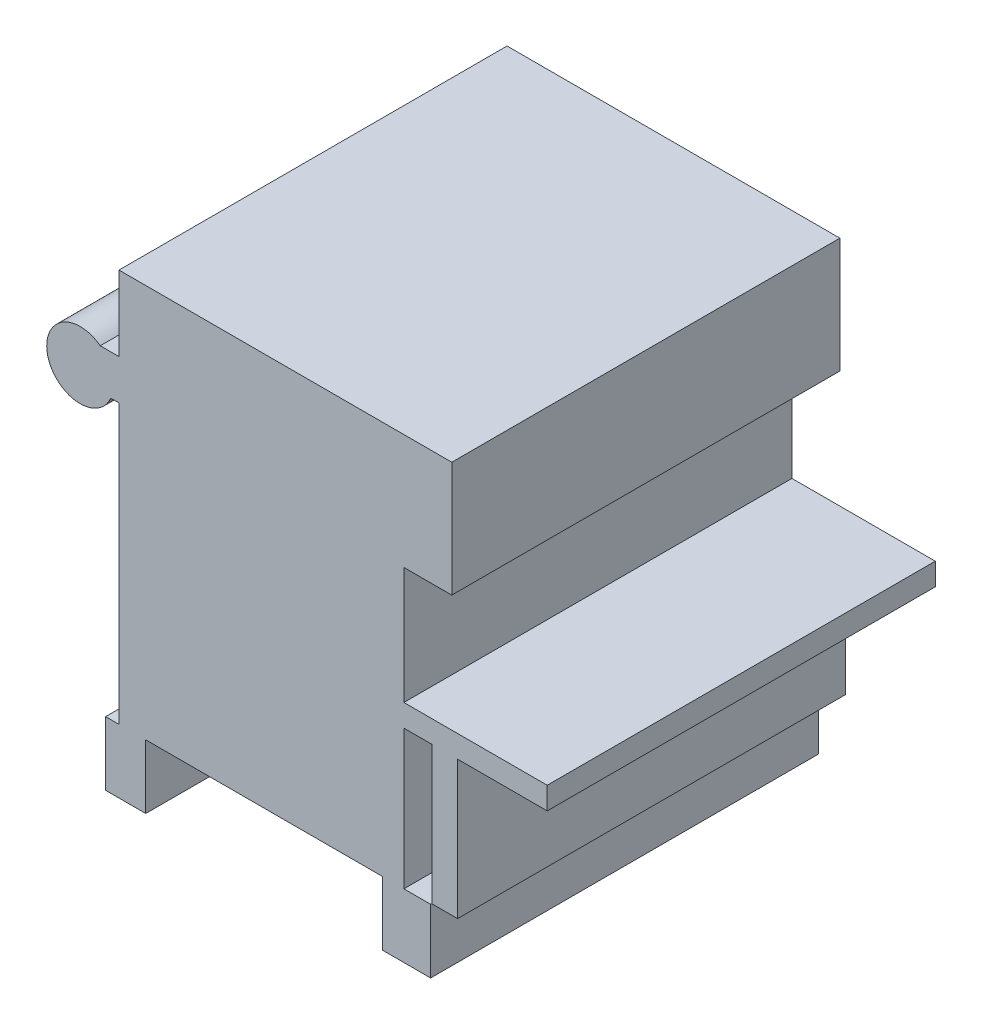
ISO-10303-21;
HEADER;
FILE_DESCRIPTION(('STEP AP214'),'2;1');
FILE_NAME('part.step','',(''),(''),'','','');
FILE_SCHEMA(('AUTOMOTIVE_DESIGN { 1 0 10303 214 1 1 1 1 }'));
ENDSEC;
DATA;
#1=APPLICATION_CONTEXT('core data for automotive mechanical design processes');
#2=APPLICATION_PROTOCOL_DEFINITION('international standard','automotive_design',2000,#1);
#3=PRODUCT_CONTEXT('',#1,'mechanical');
#4=PRODUCT('Part','Part','',(#3));
#5=PRODUCT_RELATED_PRODUCT_CATEGORY('part','',(#4));
#6=PRODUCT_DEFINITION_FORMATION('','',#4);
#7=PRODUCT_DEFINITION_CONTEXT('part definition',#1,'design');
#8=PRODUCT_DEFINITION('design','',#6,#7);
#9=PRODUCT_DEFINITION_SHAPE('','',#8);
#10=(LENGTH_UNIT() NAMED_UNIT(*) SI_UNIT(.MILLI.,.METRE.));
#11=(NAMED_UNIT(*) PLANE_ANGLE_UNIT() SI_UNIT($,.RADIAN.));
#12=(NAMED_UNIT(*) SI_UNIT($,.STERADIAN.) SOLID_ANGLE_UNIT());
#13=UNCERTAINTY_MEASURE_WITH_UNIT(LENGTH_MEASURE(1.E-05),#10,'distance_accuracy_value','');
#14=(GEOMETRIC_REPRESENTATION_CONTEXT(3) GLOBAL_UNCERTAINTY_ASSIGNED_CONTEXT((#13)) GLOBAL_UNIT_ASSIGNED_CONTEXT((#10,
#11,#12)) REPRESENTATION_CONTEXT('',''));
#15=CARTESIAN_POINT('',(0.,0.,0.));
#16=DIRECTION('',(0.,0.,1.));
#17=DIRECTION('',(1.,0.,0.));
#18=AXIS2_PLACEMENT_3D('',#15,#16,#17);
#19=CARTESIAN_POINT('',(0.,0.,736.6));
#20=DIRECTION('',(0.,-1.,0.));
#21=DIRECTION('',(1.,0.,0.));
#22=AXIS2_PLACEMENT_3D('',#19,#20,#21);
#23=PLANE('',#22);
#24=DIRECTION('',(-1.,0.,0.));
#25=VECTOR('',#24,1.);
#26=CARTESIAN_POINT('',(0.,0.,0.));
#27=LINE('',#26,#25);
#28=CARTESIAN_POINT('',(0.,0.,0.));
#29=VERTEX_POINT('',#28);
#30=CARTESIAN_POINT('',(-25.4,0.,0.));
#31=VERTEX_POINT('',#30);
#32=EDGE_CURVE('E245',#29,#31,#27,.T.);
#33=ORIENTED_EDGE('',*,*,#32,.T.);
#34=DIRECTION('',(0.,0.,-1.));
#35=VECTOR('',#34,1.);
#36=CARTESIAN_POINT('',(-25.4,0.,736.6));
#37=LINE('',#36,#35);
#38=CARTESIAN_POINT('',(-25.4,0.,736.6));
#39=VERTEX_POINT('',#38);
#40=EDGE_CURVE('E11',#39,#31,#37,.T.);
#41=ORIENTED_EDGE('',*,*,#40,.F.);
#42=DIRECTION('',(-1.,0.,0.));
#43=VECTOR('',#42,1.);
#44=CARTESIAN_POINT('',(0.,0.,736.6));
#45=LINE('',#44,#43);
#46=CARTESIAN_POINT('',(0.,0.,736.6));
#47=VERTEX_POINT('',#46);
#48=EDGE_CURVE('E296',#47,#39,#45,.T.);
#49=ORIENTED_EDGE('',*,*,#48,.F.);
#50=DIRECTION('',(0.,0.,-1.));
#51=VECTOR('',#50,1.);
#52=CARTESIAN_POINT('',(0.,0.,736.6));
#53=LINE('',#52,#51);
#54=EDGE_CURVE('E241',#47,#29,#53,.T.);
#55=ORIENTED_EDGE('',*,*,#54,.T.);
#56=EDGE_LOOP('',(#33,#41,#49,#55));
#57=FACE_BOUND('',#56,.T.);
#58=ADVANCED_FACE('F41',(#57),#23,.F.);
#59=CARTESIAN_POINT('',(-25.4,0.,736.6));
#60=DIRECTION('',(1.,0.,0.));
#61=DIRECTION('',(0.,1.,0.));
#62=AXIS2_PLACEMENT_3D('',#59,#60,#61);
#63=PLANE('',#62);
#64=DIRECTION('',(0.,-1.,0.));
#65=VECTOR('',#64,1.);
#66=CARTESIAN_POINT('',(-25.4,0.,0.));
#67=LINE('',#66,#65);
#68=CARTESIAN_POINT('',(-25.4,-121.158,0.));
#69=VERTEX_POINT('',#68);
#70=EDGE_CURVE('E248',#31,#69,#67,.T.);
#71=ORIENTED_EDGE('',*,*,#70,.T.);
#72=DIRECTION('',(0.,0.,-1.));
#73=VECTOR('',#72,1.);
#74=CARTESIAN_POINT('',(-25.4,-121.158,736.6));
#75=LINE('',#74,#73);
#76=CARTESIAN_POINT('',(-25.4,-121.158,736.6));
#77=VERTEX_POINT('',#76);
#78=EDGE_CURVE('E49',#77,#69,#75,.T.);
#79=ORIENTED_EDGE('',*,*,#78,.F.);
#80=DIRECTION('',(0.,-1.,0.));
#81=VECTOR('',#80,1.);
#82=CARTESIAN_POINT('',(-25.4,0.,736.6));
#83=LINE('',#82,#81);
#84=EDGE_CURVE('E154',#39,#77,#83,.T.);
#85=ORIENTED_EDGE('',*,*,#84,.F.);
#86=ORIENTED_EDGE('',*,*,#40,.T.);
#87=EDGE_LOOP('',(#71,#79,#85,#86));
#88=FACE_BOUND('',#87,.T.);
#89=ADVANCED_FACE('F444',(#88),#63,.F.);
#90=CARTESIAN_POINT('',(50.8,-121.158,736.6));
#91=DIRECTION('',(0.,1.,0.));
#92=DIRECTION('',(0.,0.,1.));
#93=AXIS2_PLACEMENT_3D('',#90,#91,#92);
#94=PLANE('',#93);
#95=DIRECTION('',(1.,0.,0.));
#96=VECTOR('',#95,1.);
#97=CARTESIAN_POINT('',(50.8,-121.158,0.));
#98=LINE('',#97,#96);
#99=CARTESIAN_POINT('',(50.8,-121.158,0.));
#100=VERTEX_POINT('',#99);
#101=EDGE_CURVE('E250',#69,#100,#98,.T.);
#102=ORIENTED_EDGE('',*,*,#101,.T.);
#103=DIRECTION('',(0.,0.,-1.));
#104=VECTOR('',#103,1.);
#105=CARTESIAN_POINT('',(50.8,-121.158,736.6));
#106=LINE('',#105,#104);
#107=CARTESIAN_POINT('',(50.8,-121.158,736.6));
#108=VERTEX_POINT('',#107);
#109=EDGE_CURVE('E357',#108,#100,#106,.T.);
#110=ORIENTED_EDGE('',*,*,#109,.F.);
#111=DIRECTION('',(1.,0.,0.));
#112=VECTOR('',#111,1.);
#113=CARTESIAN_POINT('',(50.8,-121.158,736.6));
#114=LINE('',#113,#112);
#115=EDGE_CURVE('E365',#77,#108,#114,.T.);
#116=ORIENTED_EDGE('',*,*,#115,.F.);
#117=ORIENTED_EDGE('',*,*,#78,.T.);
#118=EDGE_LOOP('',(#102,#110,#116,#117));
#119=FACE_BOUND('',#118,.T.);
#120=ADVANCED_FACE('F363',(#119),#94,.F.);
#121=CARTESIAN_POINT('',(50.8,0.,736.6));
#122=DIRECTION('',(-1.,0.,0.));
#123=DIRECTION('',(0.,-1.,0.));
#124=AXIS2_PLACEMENT_3D('',#121,#122,#123);
#125=PLANE('',#124);
#126=DIRECTION('',(0.,1.,0.));
#127=VECTOR('',#126,1.);
#128=CARTESIAN_POINT('',(50.8,0.,0.));
#129=LINE('',#128,#127);
#130=CARTESIAN_POINT('',(50.8,0.,0.));
#131=VERTEX_POINT('',#130);
#132=EDGE_CURVE('E252',#100,#131,#129,.T.);
#133=ORIENTED_EDGE('',*,*,#132,.T.);
#134=DIRECTION('',(0.,0.,-1.));
#135=VECTOR('',#134,1.);
#136=CARTESIAN_POINT('',(50.8,0.,736.6));
#137=LINE('',#136,#135);
#138=CARTESIAN_POINT('',(50.8,0.,736.6));
#139=VERTEX_POINT('',#138);
#140=EDGE_CURVE('E354',#139,#131,#137,.T.);
#141=ORIENTED_EDGE('',*,*,#140,.F.);
#142=DIRECTION('',(0.,1.,0.));
#143=VECTOR('',#142,1.);
#144=CARTESIAN_POINT('',(50.8,0.,736.6));
#145=LINE('',#144,#143);
#146=EDGE_CURVE('E383',#108,#139,#145,.T.);
#147=ORIENTED_EDGE('',*,*,#146,.F.);
#148=ORIENTED_EDGE('',*,*,#109,.T.);
#149=EDGE_LOOP('',(#133,#141,#147,#148));
#150=FACE_BOUND('',#149,.T.);
#151=ADVANCED_FACE('F374',(#150),#125,.F.);
#152=CARTESIAN_POINT('',(50.8,0.,736.6));
#153=DIRECTION('',(0.,1.,0.));
#154=DIRECTION('',(-1.,0.,0.));
#155=AXIS2_PLACEMENT_3D('',#152,#153,#154);
#156=PLANE('',#155);
#157=DIRECTION('',(1.,0.,0.));
#158=VECTOR('',#157,1.);
#159=CARTESIAN_POINT('',(50.8,0.,0.));
#160=LINE('',#159,#158);
#161=CARTESIAN_POINT('',(500.126,0.,0.));
#162=VERTEX_POINT('',#161);
#163=EDGE_CURVE('E254',#131,#162,#160,.T.);
#164=ORIENTED_EDGE('',*,*,#163,.T.);
#165=DIRECTION('',(0.,0.,-1.));
#166=VECTOR('',#165,1.);
#167=CARTESIAN_POINT('',(500.126,0.,736.6));
#168=LINE('',#167,#166);
#169=CARTESIAN_POINT('',(500.126,0.,736.6));
#170=VERTEX_POINT('',#169);
#171=EDGE_CURVE('E351',#170,#162,#168,.T.);
#172=ORIENTED_EDGE('',*,*,#171,.F.);
#173=DIRECTION('',(1.,0.,0.));
#174=VECTOR('',#173,1.);
#175=CARTESIAN_POINT('',(50.8,0.,736.6));
#176=LINE('',#175,#174);
#177=EDGE_CURVE('E380',#139,#170,#176,.T.);
#178=ORIENTED_EDGE('',*,*,#177,.F.);
#179=ORIENTED_EDGE('',*,*,#140,.T.);
#180=EDGE_LOOP('',(#164,#172,#178,#179));
#181=FACE_BOUND('',#180,.T.);
#182=ADVANCED_FACE('F378',(#181),#156,.F.);
#183=CARTESIAN_POINT('',(500.126,0.,736.6));
#184=DIRECTION('',(1.,0.,0.));
#185=DIRECTION('',(0.,0.,-1.));
#186=AXIS2_PLACEMENT_3D('',#183,#184,#185);
#187=PLANE('',#186);
#188=DIRECTION('',(0.,-1.,0.));
#189=VECTOR('',#188,1.);
#190=CARTESIAN_POINT('',(500.126,0.,0.));
#191=LINE('',#190,#189);
#192=CARTESIAN_POINT('',(500.126,-121.158,0.));
#193=VERTEX_POINT('',#192);
#194=EDGE_CURVE('E256',#162,#193,#191,.T.);
#195=ORIENTED_EDGE('',*,*,#194,.T.);
#196=DIRECTION('',(0.,0.,-1.));
#197=VECTOR('',#196,1.);
#198=CARTESIAN_POINT('',(500.126,-121.158,736.6));
#199=LINE('',#198,#197);
#200=CARTESIAN_POINT('',(500.126,-121.158,736.6));
#201=VERTEX_POINT('',#200);
#202=EDGE_CURVE('E348',#201,#193,#199,.T.);
#203=ORIENTED_EDGE('',*,*,#202,.F.);
#204=DIRECTION('',(0.,-1.,0.));
#205=VECTOR('',#204,1.);
#206=CARTESIAN_POINT('',(500.126,0.,736.6));
#207=LINE('',#206,#205);
#208=EDGE_CURVE('E382',#170,#201,#207,.T.);
#209=ORIENTED_EDGE('',*,*,#208,.F.);
#210=ORIENTED_EDGE('',*,*,#171,.T.);
#211=EDGE_LOOP('',(#195,#203,#209,#210));
#212=FACE_BOUND('',#211,.T.);
#213=ADVANCED_FACE('F457',(#212),#187,.F.);
#214=CARTESIAN_POINT('',(500.126,-121.158,736.6));
#215=DIRECTION('',(0.,1.,0.));
#216=DIRECTION('',(-1.,0.,0.));
#217=AXIS2_PLACEMENT_3D('',#214,#215,#216);
#218=PLANE('',#217);
#219=DIRECTION('',(1.,0.,0.));
#220=VECTOR('',#219,1.);
#221=CARTESIAN_POINT('',(500.126,-121.158,0.));
#222=LINE('',#221,#220);
#223=CARTESIAN_POINT('',(591.566,-121.158,0.));
#224=VERTEX_POINT('',#223);
#225=EDGE_CURVE('E258',#193,#224,#222,.T.);
#226=ORIENTED_EDGE('',*,*,#225,.T.);
#227=DIRECTION('',(0.,0.,-1.));
#228=VECTOR('',#227,1.);
#229=CARTESIAN_POINT('',(591.566,-121.158,736.6));
#230=LINE('',#229,#228);
#231=CARTESIAN_POINT('',(591.566,-121.158,736.6));
#232=VERTEX_POINT('',#231);
#233=EDGE_CURVE('E345',#232,#224,#230,.T.);
#234=ORIENTED_EDGE('',*,*,#233,.F.);
#235=DIRECTION('',(1.,0.,0.));
#236=VECTOR('',#235,1.);
#237=CARTESIAN_POINT('',(500.126,-121.158,736.6));
#238=LINE('',#237,#236);
#239=EDGE_CURVE('E385',#201,#232,#238,.T.);
#240=ORIENTED_EDGE('',*,*,#239,.F.);
#241=ORIENTED_EDGE('',*,*,#202,.T.);
#242=EDGE_LOOP('',(#226,#234,#240,#241));
#243=FACE_BOUND('',#242,.T.);
#244=ADVANCED_FACE('F460',(#243),#218,.F.);
#245=CARTESIAN_POINT('',(591.566,0.,736.6));
#246=DIRECTION('',(-1.,0.,0.));
#247=DIRECTION('',(0.,0.,1.));
#248=AXIS2_PLACEMENT_3D('',#245,#246,#247);
#249=PLANE('',#248);
#250=DIRECTION('',(0.,1.,0.));
#251=VECTOR('',#250,1.);
#252=CARTESIAN_POINT('',(591.566,0.,0.));
#253=LINE('',#252,#251);
#254=CARTESIAN_POINT('',(591.566,0.,0.));
#255=VERTEX_POINT('',#254);
#256=EDGE_CURVE('E260',#224,#255,#253,.T.);
#257=ORIENTED_EDGE('',*,*,#256,.T.);
#258=DIRECTION('',(0.,0.,-1.));
#259=VECTOR('',#258,1.);
#260=CARTESIAN_POINT('',(591.566,0.,736.6));
#261=LINE('',#260,#259);
#262=CARTESIAN_POINT('',(591.566,0.,736.6));
#263=VERTEX_POINT('',#262);
#264=EDGE_CURVE('E342',#263,#255,#261,.T.);
#265=ORIENTED_EDGE('',*,*,#264,.F.);
#266=DIRECTION('',(0.,1.,0.));
#267=VECTOR('',#266,1.);
#268=CARTESIAN_POINT('',(591.566,0.,736.6));
#269=LINE('',#268,#267);
#270=EDGE_CURVE('E391',#232,#263,#269,.T.);
#271=ORIENTED_EDGE('',*,*,#270,.F.);
#272=ORIENTED_EDGE('',*,*,#233,.T.);
#273=EDGE_LOOP('',(#257,#265,#271,#272));
#274=FACE_BOUND('',#273,.T.);
#275=ADVANCED_FACE('F464',(#274),#249,.F.);
#276=CARTESIAN_POINT('',(540.766,0.,736.6));
#277=DIRECTION('',(0.,-1.,0.));
#278=DIRECTION('',(0.,0.,-1.));
#279=AXIS2_PLACEMENT_3D('',#276,#277,#278);
#280=PLANE('',#279);
#281=DIRECTION('',(-1.,0.,0.));
#282=VECTOR('',#281,1.);
#283=CARTESIAN_POINT('',(540.766,0.,0.));
#284=LINE('',#283,#282);
#285=CARTESIAN_POINT('',(540.766,0.,0.));
#286=VERTEX_POINT('',#285);
#287=EDGE_CURVE('E262',#255,#286,#284,.T.);
#288=ORIENTED_EDGE('',*,*,#287,.T.);
#289=DIRECTION('',(0.,0.,-1.));
#290=VECTOR('',#289,1.);
#291=CARTESIAN_POINT('',(540.766,0.,736.6));
#292=LINE('',#291,#290);
#293=CARTESIAN_POINT('',(540.766,0.,736.6));
#294=VERTEX_POINT('',#293);
#295=EDGE_CURVE('E339',#294,#286,#292,.T.);
#296=ORIENTED_EDGE('',*,*,#295,.F.);
#297=DIRECTION('',(-1.,0.,0.));
#298=VECTOR('',#297,1.);
#299=CARTESIAN_POINT('',(540.766,0.,736.6));
#300=LINE('',#299,#298);
#301=EDGE_CURVE('E393',#263,#294,#300,.T.);
#302=ORIENTED_EDGE('',*,*,#301,.F.);
#303=ORIENTED_EDGE('',*,*,#264,.T.);
#304=EDGE_LOOP('',(#288,#296,#302,#303));
#305=FACE_BOUND('',#304,.T.);
#306=ADVANCED_FACE('F468',(#305),#280,.F.);
#307=CARTESIAN_POINT('',(540.766,0.,736.6));
#308=DIRECTION('',(-1.,0.,0.));
#309=DIRECTION('',(0.,0.,1.));
#310=AXIS2_PLACEMENT_3D('',#307,#308,#309);
#311=PLANE('',#310);
#312=DIRECTION('',(0.,1.,0.));
#313=VECTOR('',#312,1.);
#314=CARTESIAN_POINT('',(540.766,0.,0.));
#315=LINE('',#314,#313);
#316=CARTESIAN_POINT('',(540.766,264.16,0.));
#317=VERTEX_POINT('',#316);
#318=EDGE_CURVE('E264',#286,#317,#315,.T.);
#319=ORIENTED_EDGE('',*,*,#318,.T.);
#320=DIRECTION('',(0.,0.,-1.));
#321=VECTOR('',#320,1.);
#322=CARTESIAN_POINT('',(540.766,264.16,736.6));
#323=LINE('',#322,#321);
#324=CARTESIAN_POINT('',(540.766,264.16,736.6));
#325=VERTEX_POINT('',#324);
#326=EDGE_CURVE('E336',#325,#317,#323,.T.);
#327=ORIENTED_EDGE('',*,*,#326,.F.);
#328=DIRECTION('',(0.,1.,0.));
#329=VECTOR('',#328,1.);
#330=CARTESIAN_POINT('',(540.766,0.,736.6));
#331=LINE('',#330,#329);
#332=EDGE_CURVE('E395',#294,#325,#331,.T.);
#333=ORIENTED_EDGE('',*,*,#332,.F.);
#334=ORIENTED_EDGE('',*,*,#295,.T.);
#335=EDGE_LOOP('',(#319,#327,#333,#334));
#336=FACE_BOUND('',#335,.T.);
#337=ADVANCED_FACE('F472',(#336),#311,.F.);
#338=CARTESIAN_POINT('',(540.766,264.16,736.6));
#339=DIRECTION('',(0.,1.,0.));
#340=DIRECTION('',(0.,0.,1.));
#341=AXIS2_PLACEMENT_3D('',#338,#339,#340);
#342=PLANE('',#341);
#343=DIRECTION('',(1.,0.,0.));
#344=VECTOR('',#343,1.);
#345=CARTESIAN_POINT('',(540.766,264.16,0.));
#346=LINE('',#345,#344);
#347=CARTESIAN_POINT('',(594.106,264.16,0.));
#348=VERTEX_POINT('',#347);
#349=EDGE_CURVE('E266',#317,#348,#346,.T.);
#350=ORIENTED_EDGE('',*,*,#349,.T.);
#351=DIRECTION('',(0.,0.,-1.));
#352=VECTOR('',#351,1.);
#353=CARTESIAN_POINT('',(594.106,264.16,736.6));
#354=LINE('',#353,#352);
#355=CARTESIAN_POINT('',(594.106,264.16,736.6));
#356=VERTEX_POINT('',#355);
#357=EDGE_CURVE('E333',#356,#348,#354,.T.);
#358=ORIENTED_EDGE('',*,*,#357,.F.);
#359=DIRECTION('',(1.,0.,0.));
#360=VECTOR('',#359,1.);
#361=CARTESIAN_POINT('',(540.766,264.16,736.6));
#362=LINE('',#361,#360);
#363=EDGE_CURVE('E397',#325,#356,#362,.T.);
#364=ORIENTED_EDGE('',*,*,#363,.F.);
#365=ORIENTED_EDGE('',*,*,#326,.T.);
#366=EDGE_LOOP('',(#350,#358,#364,#365));
#367=FACE_BOUND('',#366,.T.);
#368=ADVANCED_FACE('F476',(#367),#342,.F.);
#369=CARTESIAN_POINT('',(594.106,264.16,736.6));
#370=DIRECTION('',(1.,0.,0.));
#371=DIRECTION('',(0.,1.,0.));
#372=AXIS2_PLACEMENT_3D('',#369,#370,#371);
#373=PLANE('',#372);
#374=DIRECTION('',(0.,-1.,0.));
#375=VECTOR('',#374,1.);
#376=CARTESIAN_POINT('',(594.106,264.16,0.));
#377=LINE('',#376,#375);
#378=CARTESIAN_POINT('',(594.106,2.03200000000004,0.));
#379=VERTEX_POINT('',#378);
#380=EDGE_CURVE('E268',#348,#379,#377,.T.);
#381=ORIENTED_EDGE('',*,*,#380,.T.);
#382=DIRECTION('',(0.,0.,-1.));
#383=VECTOR('',#382,1.);
#384=CARTESIAN_POINT('',(594.106,2.03200000000004,736.6));
#385=LINE('',#384,#383);
#386=CARTESIAN_POINT('',(594.106,2.03200000000004,736.6));
#387=VERTEX_POINT('',#386);
#388=EDGE_CURVE('E330',#387,#379,#385,.T.);
#389=ORIENTED_EDGE('',*,*,#388,.F.);
#390=DIRECTION('',(0.,-1.,0.));
#391=VECTOR('',#390,1.);
#392=CARTESIAN_POINT('',(594.106,264.16,736.6));
#393=LINE('',#392,#391);
#394=EDGE_CURVE('E399',#356,#387,#393,.T.);
#395=ORIENTED_EDGE('',*,*,#394,.F.);
#396=ORIENTED_EDGE('',*,*,#357,.T.);
#397=EDGE_LOOP('',(#381,#389,#395,#396));
#398=FACE_BOUND('',#397,.T.);
#399=ADVANCED_FACE('F480',(#398),#373,.F.);
#400=CARTESIAN_POINT('',(594.106,2.03200000000004,736.6));
#401=DIRECTION('',(0.,1.,0.));
#402=DIRECTION('',(-1.,0.,0.));
#403=AXIS2_PLACEMENT_3D('',#400,#401,#402);
#404=PLANE('',#403);
#405=DIRECTION('',(1.,0.,0.));
#406=VECTOR('',#405,1.);
#407=CARTESIAN_POINT('',(594.106,2.03200000000004,0.));
#408=LINE('',#407,#406);
#409=CARTESIAN_POINT('',(642.704381110772,2.03200000000004,0.));
#410=VERTEX_POINT('',#409);
#411=EDGE_CURVE('E270',#379,#410,#408,.T.);
#412=ORIENTED_EDGE('',*,*,#411,.T.);
#413=DIRECTION('',(0.,0.,-1.));
#414=VECTOR('',#413,1.);
#415=CARTESIAN_POINT('',(642.704381110772,2.03200000000004,736.6));
#416=LINE('',#415,#414);
#417=CARTESIAN_POINT('',(642.704381110772,2.03200000000004,736.6));
#418=VERTEX_POINT('',#417);
#419=EDGE_CURVE('E327',#418,#410,#416,.T.);
#420=ORIENTED_EDGE('',*,*,#419,.F.);
#421=DIRECTION('',(1.,0.,0.));
#422=VECTOR('',#421,1.);
#423=CARTESIAN_POINT('',(594.106,2.03200000000004,736.6));
#424=LINE('',#423,#422);
#425=EDGE_CURVE('E401',#387,#418,#424,.T.);
#426=ORIENTED_EDGE('',*,*,#425,.F.);
#427=ORIENTED_EDGE('',*,*,#388,.T.);
#428=EDGE_LOOP('',(#412,#420,#426,#427));
#429=FACE_BOUND('',#428,.T.);
#430=ADVANCED_FACE('F484',(#429),#404,.F.);
#431=CARTESIAN_POINT('',(642.704381110772,264.16,736.6));
#432=DIRECTION('',(-1.,0.,0.));
#433=DIRECTION('',(0.,0.,1.));
#434=AXIS2_PLACEMENT_3D('',#431,#432,#433);
#435=PLANE('',#434);
#436=DIRECTION('',(0.,1.,0.));
#437=VECTOR('',#436,1.);
#438=CARTESIAN_POINT('',(642.704381110772,264.16,0.));
#439=LINE('',#438,#437);
#440=CARTESIAN_POINT('',(642.704381110772,264.16,0.));
#441=VERTEX_POINT('',#440);
#442=EDGE_CURVE('E272',#410,#441,#439,.T.);
#443=ORIENTED_EDGE('',*,*,#442,.T.);
#444=DIRECTION('',(0.,0.,-1.));
#445=VECTOR('',#444,1.);
#446=CARTESIAN_POINT('',(642.704381110772,264.16,736.6));
#447=LINE('',#446,#445);
#448=CARTESIAN_POINT('',(642.704381110772,264.16,736.6));
#449=VERTEX_POINT('',#448);
#450=EDGE_CURVE('E324',#449,#441,#447,.T.);
#451=ORIENTED_EDGE('',*,*,#450,.F.);
#452=DIRECTION('',(0.,1.,0.));
#453=VECTOR('',#452,1.);
#454=CARTESIAN_POINT('',(642.704381110772,264.16,736.6));
#455=LINE('',#454,#453);
#456=EDGE_CURVE('E403',#418,#449,#455,.T.);
#457=ORIENTED_EDGE('',*,*,#456,.F.);
#458=ORIENTED_EDGE('',*,*,#419,.T.);
#459=EDGE_LOOP('',(#443,#451,#457,#458));
#460=FACE_BOUND('',#459,.T.);
#461=ADVANCED_FACE('F488',(#460),#435,.F.);
#462=CARTESIAN_POINT('',(642.704381110772,264.16,736.6));
#463=DIRECTION('',(0.,1.,0.));
#464=DIRECTION('',(0.,0.,1.));
#465=AXIS2_PLACEMENT_3D('',#462,#463,#464);
#466=PLANE('',#465);
#467=DIRECTION('',(1.,0.,0.));
#468=VECTOR('',#467,1.);
#469=CARTESIAN_POINT('',(642.704381110772,264.16,0.));
#470=LINE('',#469,#468);
#471=CARTESIAN_POINT('',(812.8,264.16,0.));
#472=VERTEX_POINT('',#471);
#473=EDGE_CURVE('E274',#441,#472,#470,.T.);
#474=ORIENTED_EDGE('',*,*,#473,.T.);
#475=DIRECTION('',(0.,0.,-1.));
#476=VECTOR('',#475,1.);
#477=CARTESIAN_POINT('',(812.8,264.16,736.6));
#478=LINE('',#477,#476);
#479=CARTESIAN_POINT('',(812.8,264.16,736.6));
#480=VERTEX_POINT('',#479);
#481=EDGE_CURVE('E321',#480,#472,#478,.T.);
#482=ORIENTED_EDGE('',*,*,#481,.F.);
#483=DIRECTION('',(1.,0.,0.));
#484=VECTOR('',#483,1.);
#485=CARTESIAN_POINT('',(642.704381110772,264.16,736.6));
#486=LINE('',#485,#484);
#487=EDGE_CURVE('E405',#449,#480,#486,.T.);
#488=ORIENTED_EDGE('',*,*,#487,.F.);
#489=ORIENTED_EDGE('',*,*,#450,.T.);
#490=EDGE_LOOP('',(#474,#482,#488,#489));
#491=FACE_BOUND('',#490,.T.);
#492=ADVANCED_FACE('F492',(#491),#466,.F.);
#493=CARTESIAN_POINT('',(812.8,264.16,736.6));
#494=DIRECTION('',(-1.,0.,0.));
#495=DIRECTION('',(0.,0.,1.));
#496=AXIS2_PLACEMENT_3D('',#493,#494,#495);
#497=PLANE('',#496);
#498=DIRECTION('',(0.,1.,0.));
#499=VECTOR('',#498,1.);
#500=CARTESIAN_POINT('',(812.8,264.16,0.));
#501=LINE('',#500,#499);
#502=CARTESIAN_POINT('',(812.8,306.324,0.));
#503=VERTEX_POINT('',#502);
#504=EDGE_CURVE('E276',#472,#503,#501,.T.);
#505=ORIENTED_EDGE('',*,*,#504,.T.);
#506=DIRECTION('',(0.,0.,-1.));
#507=VECTOR('',#506,1.);
#508=CARTESIAN_POINT('',(812.8,306.324,736.6));
#509=LINE('',#508,#507);
#510=CARTESIAN_POINT('',(812.8,306.324,736.6));
#511=VERTEX_POINT('',#510);
#512=EDGE_CURVE('E318',#511,#503,#509,.T.);
#513=ORIENTED_EDGE('',*,*,#512,.F.);
#514=DIRECTION('',(0.,1.,0.));
#515=VECTOR('',#514,1.);
#516=CARTESIAN_POINT('',(812.8,264.16,736.6));
#517=LINE('',#516,#515);
#518=EDGE_CURVE('E407',#480,#511,#517,.T.);
#519=ORIENTED_EDGE('',*,*,#518,.F.);
#520=ORIENTED_EDGE('',*,*,#481,.T.);
#521=EDGE_LOOP('',(#505,#513,#519,#520));
#522=FACE_BOUND('',#521,.T.);
#523=ADVANCED_FACE('F496',(#522),#497,.F.);
#524=CARTESIAN_POINT('',(540.766,306.324,736.6));
#525=DIRECTION('',(0.,-1.,0.));
#526=DIRECTION('',(0.,0.,-1.));
#527=AXIS2_PLACEMENT_3D('',#524,#525,#526);
#528=PLANE('',#527);
#529=DIRECTION('',(-1.,0.,0.));
#530=VECTOR('',#529,1.);
#531=CARTESIAN_POINT('',(540.766,306.324,0.));
#532=LINE('',#531,#530);
#533=CARTESIAN_POINT('',(540.766,306.324,0.));
#534=VERTEX_POINT('',#533);
#535=EDGE_CURVE('E278',#503,#534,#532,.T.);
#536=ORIENTED_EDGE('',*,*,#535,.T.);
#537=DIRECTION('',(0.,0.,-1.));
#538=VECTOR('',#537,1.);
#539=CARTESIAN_POINT('',(540.766,306.324,736.6));
#540=LINE('',#539,#538);
#541=CARTESIAN_POINT('',(540.766,306.324,736.6));
#542=VERTEX_POINT('',#541);
#543=EDGE_CURVE('E315',#542,#534,#540,.T.);
#544=ORIENTED_EDGE('',*,*,#543,.F.);
#545=DIRECTION('',(-1.,0.,0.));
#546=VECTOR('',#545,1.);
#547=CARTESIAN_POINT('',(540.766,306.324,736.6));
#548=LINE('',#547,#546);
#549=EDGE_CURVE('E409',#511,#542,#548,.T.);
#550=ORIENTED_EDGE('',*,*,#549,.F.);
#551=ORIENTED_EDGE('',*,*,#512,.T.);
#552=EDGE_LOOP('',(#536,#544,#550,#551));
#553=FACE_BOUND('',#552,.T.);
#554=ADVANCED_FACE('F500',(#553),#528,.F.);
#555=CARTESIAN_POINT('',(540.766,306.324,736.6));
#556=DIRECTION('',(-1.,0.,0.));
#557=DIRECTION('',(0.,0.,1.));
#558=AXIS2_PLACEMENT_3D('',#555,#556,#557);
#559=PLANE('',#558);
#560=DIRECTION('',(0.,1.,0.));
#561=VECTOR('',#560,1.);
#562=CARTESIAN_POINT('',(540.766,306.324,0.));
#563=LINE('',#562,#561);
#564=CARTESIAN_POINT('',(540.766,528.32,0.));
#565=VERTEX_POINT('',#564);
#566=EDGE_CURVE('E280',#534,#565,#563,.T.);
#567=ORIENTED_EDGE('',*,*,#566,.T.);
#568=DIRECTION('',(0.,0.,-1.));
#569=VECTOR('',#568,1.);
#570=CARTESIAN_POINT('',(540.766,528.32,736.6));
#571=LINE('',#570,#569);
#572=CARTESIAN_POINT('',(540.766,528.32,736.6));
#573=VERTEX_POINT('',#572);
#574=EDGE_CURVE('E312',#573,#565,#571,.T.);
#575=ORIENTED_EDGE('',*,*,#574,.F.);
#576=DIRECTION('',(0.,1.,0.));
#577=VECTOR('',#576,1.);
#578=CARTESIAN_POINT('',(540.766,306.324,736.6));
#579=LINE('',#578,#577);
#580=EDGE_CURVE('E411',#542,#573,#579,.T.);
#581=ORIENTED_EDGE('',*,*,#580,.F.);
#582=ORIENTED_EDGE('',*,*,#543,.T.);
#583=EDGE_LOOP('',(#567,#575,#581,#582));
#584=FACE_BOUND('',#583,.T.);
#585=ADVANCED_FACE('F504',(#584),#559,.F.);
#586=CARTESIAN_POINT('',(540.766,528.32,736.6));
#587=DIRECTION('',(0.,1.,0.));
#588=DIRECTION('',(0.,0.,1.));
#589=AXIS2_PLACEMENT_3D('',#586,#587,#588);
#590=PLANE('',#589);
#591=DIRECTION('',(1.,0.,0.));
#592=VECTOR('',#591,1.);
#593=CARTESIAN_POINT('',(540.766,528.32,0.));
#594=LINE('',#593,#592);
#595=CARTESIAN_POINT('',(631.698,528.32,0.));
#596=VERTEX_POINT('',#595);
#597=EDGE_CURVE('E282',#565,#596,#594,.T.);
#598=ORIENTED_EDGE('',*,*,#597,.T.);
#599=DIRECTION('',(0.,0.,-1.));
#600=VECTOR('',#599,1.);
#601=CARTESIAN_POINT('',(631.698,528.32,736.6));
#602=LINE('',#601,#600);
#603=CARTESIAN_POINT('',(631.698,528.32,736.6));
#604=VERTEX_POINT('',#603);
#605=EDGE_CURVE('E309',#604,#596,#602,.T.);
#606=ORIENTED_EDGE('',*,*,#605,.F.);
#607=DIRECTION('',(1.,0.,0.));
#608=VECTOR('',#607,1.);
#609=CARTESIAN_POINT('',(540.766,528.32,736.6));
#610=LINE('',#609,#608);
#611=EDGE_CURVE('E413',#573,#604,#610,.T.);
#612=ORIENTED_EDGE('',*,*,#611,.F.);
#613=ORIENTED_EDGE('',*,*,#574,.T.);
#614=EDGE_LOOP('',(#598,#606,#612,#613));
#615=FACE_BOUND('',#614,.T.);
#616=ADVANCED_FACE('F508',(#615),#590,.F.);
#617=CARTESIAN_POINT('',(631.698,550.164,736.6));
#618=DIRECTION('',(-1.,0.,0.));
#619=DIRECTION('',(0.,0.,1.));
#620=AXIS2_PLACEMENT_3D('',#617,#618,#619);
#621=PLANE('',#620);
#622=DIRECTION('',(0.,1.,0.));
#623=VECTOR('',#622,1.);
#624=CARTESIAN_POINT('',(631.698,550.164,0.));
#625=LINE('',#624,#623);
#626=CARTESIAN_POINT('',(631.698,746.76,0.));
#627=VERTEX_POINT('',#626);
#628=EDGE_CURVE('E285',#596,#627,#625,.T.);
#629=ORIENTED_EDGE('',*,*,#628,.T.);
#630=DIRECTION('',(0.,0.,-1.));
#631=VECTOR('',#630,1.);
#632=CARTESIAN_POINT('',(631.698,746.76,736.6));
#633=LINE('',#632,#631);
#634=CARTESIAN_POINT('',(631.698,746.76,736.6));
#635=VERTEX_POINT('',#634);
#636=EDGE_CURVE('E306',#635,#627,#633,.T.);
#637=ORIENTED_EDGE('',*,*,#636,.F.);
#638=DIRECTION('',(0.,1.,0.));
#639=VECTOR('',#638,1.);
#640=CARTESIAN_POINT('',(631.698,528.32,736.6));
#641=LINE('',#640,#639);
#642=EDGE_CURVE('E415',#604,#635,#641,.T.);
#643=ORIENTED_EDGE('',*,*,#642,.F.);
#644=ORIENTED_EDGE('',*,*,#605,.T.);
#645=EDGE_LOOP('',(#629,#637,#643,#644));
#646=FACE_BOUND('',#645,.T.);
#647=ADVANCED_FACE('F512',(#646),#621,.F.);
#648=CARTESIAN_POINT('',(0.,746.76,736.6));
#649=DIRECTION('',(0.,-1.,0.));
#650=DIRECTION('',(0.,0.,-1.));
#651=AXIS2_PLACEMENT_3D('',#648,#649,#650);
#652=PLANE('',#651);
#653=DIRECTION('',(-1.,0.,0.));
#654=VECTOR('',#653,1.);
#655=CARTESIAN_POINT('',(0.,746.76,0.));
#656=LINE('',#655,#654);
#657=CARTESIAN_POINT('',(0.,746.76,0.));
#658=VERTEX_POINT('',#657);
#659=EDGE_CURVE('E287',#627,#658,#656,.T.);
#660=ORIENTED_EDGE('',*,*,#659,.T.);
#661=DIRECTION('',(0.,0.,-1.));
#662=VECTOR('',#661,1.);
#663=CARTESIAN_POINT('',(0.,746.76,736.6));
#664=LINE('',#663,#662);
#665=CARTESIAN_POINT('',(0.,746.76,736.6));
#666=VERTEX_POINT('',#665);
#667=EDGE_CURVE('E303',#666,#658,#664,.T.);
#668=ORIENTED_EDGE('',*,*,#667,.F.);
#669=DIRECTION('',(-1.,0.,0.));
#670=VECTOR('',#669,1.);
#671=CARTESIAN_POINT('',(0.,746.76,736.6));
#672=LINE('',#671,#670);
#673=EDGE_CURVE('E417',#635,#666,#672,.T.);
#674=ORIENTED_EDGE('',*,*,#673,.F.);
#675=ORIENTED_EDGE('',*,*,#636,.T.);
#676=EDGE_LOOP('',(#660,#668,#674,#675));
#677=FACE_BOUND('',#676,.T.);
#678=ADVANCED_FACE('F516',(#677),#652,.F.);
#679=CARTESIAN_POINT('',(0.,604.52,736.6));
#680=DIRECTION('',(1.,0.,0.));
#681=DIRECTION('',(0.,1.,0.));
#682=AXIS2_PLACEMENT_3D('',#679,#680,#681);
#683=PLANE('',#682);
#684=DIRECTION('',(0.,-1.,0.));
#685=VECTOR('',#684,1.);
#686=CARTESIAN_POINT('',(0.,604.52,0.));
#687=LINE('',#686,#685);
#688=CARTESIAN_POINT('',(0.,604.52,0.));
#689=VERTEX_POINT('',#688);
#690=EDGE_CURVE('E289',#658,#689,#687,.T.);
#691=ORIENTED_EDGE('',*,*,#690,.T.);
#692=DIRECTION('',(0.,0.,-1.));
#693=VECTOR('',#692,1.);
#694=CARTESIAN_POINT('',(0.,604.52,736.6));
#695=LINE('',#694,#693);
#696=CARTESIAN_POINT('',(0.,604.52,736.6));
#697=VERTEX_POINT('',#696);
#698=EDGE_CURVE('E300',#697,#689,#695,.T.);
#699=ORIENTED_EDGE('',*,*,#698,.F.);
#700=DIRECTION('',(0.,-1.,0.));
#701=VECTOR('',#700,1.);
#702=CARTESIAN_POINT('',(0.,604.52,736.6));
#703=LINE('',#702,#701);
#704=EDGE_CURVE('E419',#666,#697,#703,.T.);
#705=ORIENTED_EDGE('',*,*,#704,.F.);
#706=ORIENTED_EDGE('',*,*,#667,.T.);
#707=EDGE_LOOP('',(#691,#699,#705,#706));
#708=FACE_BOUND('',#707,.T.);
#709=ADVANCED_FACE('F425',(#708),#683,.F.);
#710=CARTESIAN_POINT('',(0.,604.52,736.6));
#711=DIRECTION('',(0.,-1.,0.));
#712=DIRECTION('',(0.,0.,-1.));
#713=AXIS2_PLACEMENT_3D('',#710,#711,#712);
#714=PLANE('',#713);
#715=DIRECTION('',(-1.,0.,0.));
#716=VECTOR('',#715,1.);
#717=CARTESIAN_POINT('',(0.,604.52,0.));
#718=LINE('',#717,#716);
#719=CARTESIAN_POINT('',(-35.5599999999998,604.52,0.));
#720=VERTEX_POINT('',#719);
#721=EDGE_CURVE('E291',#689,#720,#718,.T.);
#722=ORIENTED_EDGE('',*,*,#721,.T.);
#723=DIRECTION('',(0.,0.,-1.));
#724=VECTOR('',#723,1.);
#725=CARTESIAN_POINT('',(-35.5599999999998,604.52,736.6));
#726=LINE('',#725,#724);
#727=CARTESIAN_POINT('',(-35.5599999999998,604.52,736.6));
#728=VERTEX_POINT('',#727);
#729=EDGE_CURVE('E236',#728,#720,#726,.T.);
#730=ORIENTED_EDGE('',*,*,#729,.F.);
#731=DIRECTION('',(-1.,0.,0.));
#732=VECTOR('',#731,1.);
#733=CARTESIAN_POINT('',(0.,604.52,736.6));
#734=LINE('',#733,#732);
#735=EDGE_CURVE('E227',#697,#728,#734,.T.);
#736=ORIENTED_EDGE('',*,*,#735,.F.);
#737=ORIENTED_EDGE('',*,*,#698,.T.);
#738=EDGE_LOOP('',(#722,#730,#736,#737));
#739=FACE_BOUND('',#738,.T.);
#740=ADVANCED_FACE('F429',(#739),#714,.F.);
#741=CARTESIAN_POINT('',(-73.66,553.72,736.6));
#742=DIRECTION('',(0.,0.,-1.));
#743=DIRECTION('',(-1.,0.,0.));
#744=AXIS2_PLACEMENT_3D('',#741,#742,#743);
#745=CYLINDRICAL_SURFACE('',#744,63.5000000000001);
#746=CARTESIAN_POINT('',(-73.66,553.72,0.));
#747=DIRECTION('',(0.,0.,1.));
#748=DIRECTION('',(1.,0.,0.));
#749=AXIS2_PLACEMENT_3D('',#746,#747,#748);
#750=CIRCLE('',#749,63.5000000000001);
#751=CARTESIAN_POINT('',(-15.4612886740608,528.32,0.));
#752=VERTEX_POINT('',#751);
#753=EDGE_CURVE('E235',#720,#752,#750,.T.);
#754=ORIENTED_EDGE('',*,*,#753,.T.);
#755=DIRECTION('',(0.,0.,-1.));
#756=VECTOR('',#755,1.);
#757=CARTESIAN_POINT('',(-15.4612886740608,528.32,736.6));
#758=LINE('',#757,#756);
#759=CARTESIAN_POINT('',(-15.4612886740608,528.32,736.6));
#760=VERTEX_POINT('',#759);
#761=EDGE_CURVE('E232',#760,#752,#758,.T.);
#762=ORIENTED_EDGE('',*,*,#761,.F.);
#763=CARTESIAN_POINT('',(-73.66,553.72,736.6));
#764=DIRECTION('',(0.,0.,1.));
#765=DIRECTION('',(1.,0.,0.));
#766=AXIS2_PLACEMENT_3D('',#763,#764,#765);
#767=CIRCLE('',#766,63.5000000000001);
#768=EDGE_CURVE('E221',#728,#760,#767,.T.);
#769=ORIENTED_EDGE('',*,*,#768,.F.);
#770=ORIENTED_EDGE('',*,*,#729,.T.);
#771=EDGE_LOOP('',(#754,#762,#769,#770));
#772=FACE_BOUND('',#771,.T.);
#773=ADVANCED_FACE('F233',(#772),#745,.T.);
#774=CARTESIAN_POINT('',(0.,528.32,736.6));
#775=DIRECTION('',(0.,1.,0.));
#776=DIRECTION('',(0.,0.,1.));
#777=AXIS2_PLACEMENT_3D('',#774,#775,#776);
#778=PLANE('',#777);
#779=DIRECTION('',(1.,0.,0.));
#780=VECTOR('',#779,1.);
#781=CARTESIAN_POINT('',(0.,528.32,0.));
#782=LINE('',#781,#780);
#783=CARTESIAN_POINT('',(0.,528.32,0.));
#784=VERTEX_POINT('',#783);
#785=EDGE_CURVE('E140',#752,#784,#782,.T.);
#786=ORIENTED_EDGE('',*,*,#785,.T.);
#787=DIRECTION('',(0.,0.,-1.));
#788=VECTOR('',#787,1.);
#789=CARTESIAN_POINT('',(0.,528.32,736.6));
#790=LINE('',#789,#788);
#791=CARTESIAN_POINT('',(0.,528.32,736.6));
#792=VERTEX_POINT('',#791);
#793=EDGE_CURVE('E237',#792,#784,#790,.T.);
#794=ORIENTED_EDGE('',*,*,#793,.F.);
#795=DIRECTION('',(1.,0.,0.));
#796=VECTOR('',#795,1.);
#797=CARTESIAN_POINT('',(0.,528.32,736.6));
#798=LINE('',#797,#796);
#799=EDGE_CURVE('E225',#760,#792,#798,.T.);
#800=ORIENTED_EDGE('',*,*,#799,.F.);
#801=ORIENTED_EDGE('',*,*,#761,.T.);
#802=EDGE_LOOP('',(#786,#794,#800,#801));
#803=FACE_BOUND('',#802,.T.);
#804=ADVANCED_FACE('F239',(#803),#778,.F.);
#805=CARTESIAN_POINT('',(0.,0.,736.6));
#806=DIRECTION('',(1.,0.,0.));
#807=DIRECTION('',(0.,0.,-1.));
#808=AXIS2_PLACEMENT_3D('',#805,#806,#807);
#809=PLANE('',#808);
#810=DIRECTION('',(0.,-1.,0.));
#811=VECTOR('',#810,1.);
#812=CARTESIAN_POINT('',(0.,0.,0.));
#813=LINE('',#812,#811);
#814=EDGE_CURVE('E146',#784,#29,#813,.T.);
#815=ORIENTED_EDGE('',*,*,#814,.T.);
#816=ORIENTED_EDGE('',*,*,#54,.F.);
#817=DIRECTION('',(0.,-1.,0.));
#818=VECTOR('',#817,1.);
#819=CARTESIAN_POINT('',(0.,0.,736.6));
#820=LINE('',#819,#818);
#821=EDGE_CURVE('E57',#792,#47,#820,.T.);
#822=ORIENTED_EDGE('',*,*,#821,.F.);
#823=ORIENTED_EDGE('',*,*,#793,.T.);
#824=EDGE_LOOP('',(#815,#816,#822,#823));
#825=FACE_BOUND('',#824,.T.);
#826=ADVANCED_FACE('F433',(#825),#809,.F.);
#827=CARTESIAN_POINT('',(-73.66,553.72,736.6));
#828=DIRECTION('',(0.,0.,1.));
#829=DIRECTION('',(1.,0.,0.));
#830=AXIS2_PLACEMENT_3D('',#827,#828,#829);
#831=PLANE('',#830);
#832=ORIENTED_EDGE('',*,*,#48,.T.);
#833=ORIENTED_EDGE('',*,*,#84,.T.);
#834=ORIENTED_EDGE('',*,*,#115,.T.);
#835=ORIENTED_EDGE('',*,*,#146,.T.);
#836=ORIENTED_EDGE('',*,*,#177,.T.);
#837=ORIENTED_EDGE('',*,*,#208,.T.);
#838=ORIENTED_EDGE('',*,*,#239,.T.);
#839=ORIENTED_EDGE('',*,*,#270,.T.);
#840=ORIENTED_EDGE('',*,*,#301,.T.);
#841=ORIENTED_EDGE('',*,*,#332,.T.);
#842=ORIENTED_EDGE('',*,*,#363,.T.);
#843=ORIENTED_EDGE('',*,*,#394,.T.);
#844=ORIENTED_EDGE('',*,*,#425,.T.);
#845=ORIENTED_EDGE('',*,*,#456,.T.);
#846=ORIENTED_EDGE('',*,*,#487,.T.);
#847=ORIENTED_EDGE('',*,*,#518,.T.);
#848=ORIENTED_EDGE('',*,*,#549,.T.);
#849=ORIENTED_EDGE('',*,*,#580,.T.);
#850=ORIENTED_EDGE('',*,*,#611,.T.);
#851=ORIENTED_EDGE('',*,*,#642,.T.);
#852=ORIENTED_EDGE('',*,*,#673,.T.);
#853=ORIENTED_EDGE('',*,*,#704,.T.);
#854=ORIENTED_EDGE('',*,*,#735,.T.);
#855=ORIENTED_EDGE('',*,*,#768,.T.);
#856=ORIENTED_EDGE('',*,*,#799,.T.);
#857=ORIENTED_EDGE('',*,*,#821,.T.);
#858=EDGE_LOOP('',(#832,#833,#834,#835,#836,#837,#838,#839,#840,#841,#842,#843,#844,#845,#846,
#847,#848,#849,#850,#851,#852,#853,#854,#855,#856,#857));
#859=FACE_BOUND('',#858,.T.);
#860=ADVANCED_FACE('F223',(#859),#831,.T.);
#861=CARTESIAN_POINT('',(-73.66,553.72,0.));
#862=DIRECTION('',(0.,0.,1.));
#863=DIRECTION('',(1.,0.,0.));
#864=AXIS2_PLACEMENT_3D('',#861,#862,#863);
#865=PLANE('',#864);
#866=ORIENTED_EDGE('',*,*,#32,.F.);
#867=ORIENTED_EDGE('',*,*,#814,.F.);
#868=ORIENTED_EDGE('',*,*,#785,.F.);
#869=ORIENTED_EDGE('',*,*,#753,.F.);
#870=ORIENTED_EDGE('',*,*,#721,.F.);
#871=ORIENTED_EDGE('',*,*,#690,.F.);
#872=ORIENTED_EDGE('',*,*,#659,.F.);
#873=ORIENTED_EDGE('',*,*,#628,.F.);
#874=ORIENTED_EDGE('',*,*,#597,.F.);
#875=ORIENTED_EDGE('',*,*,#566,.F.);
#876=ORIENTED_EDGE('',*,*,#535,.F.);
#877=ORIENTED_EDGE('',*,*,#504,.F.);
#878=ORIENTED_EDGE('',*,*,#473,.F.);
#879=ORIENTED_EDGE('',*,*,#442,.F.);
#880=ORIENTED_EDGE('',*,*,#411,.F.);
#881=ORIENTED_EDGE('',*,*,#380,.F.);
#882=ORIENTED_EDGE('',*,*,#349,.F.);
#883=ORIENTED_EDGE('',*,*,#318,.F.);
#884=ORIENTED_EDGE('',*,*,#287,.F.);
#885=ORIENTED_EDGE('',*,*,#256,.F.);
#886=ORIENTED_EDGE('',*,*,#225,.F.);
#887=ORIENTED_EDGE('',*,*,#194,.F.);
#888=ORIENTED_EDGE('',*,*,#163,.F.);
#889=ORIENTED_EDGE('',*,*,#132,.F.);
#890=ORIENTED_EDGE('',*,*,#101,.F.);
#891=ORIENTED_EDGE('',*,*,#70,.F.);
#892=EDGE_LOOP('',(#866,#867,#868,#869,#870,#871,#872,#873,#874,#875,#876,#877,#878,#879,#880,
#881,#882,#883,#884,#885,#886,#887,#888,#889,#890,#891));
#893=FACE_BOUND('',#892,.T.);
#894=ADVANCED_FACE('F369',(#893),#865,.F.);
#895=CLOSED_SHELL('',(#58,#89,#120,#151,#182,#213,#244,#275,#306,#337,#368,#399,#430,#461,#492,
#523,#554,#585,#616,#647,#678,#709,#740,#773,#804,#826,#860,#894));
#896=MANIFOLD_SOLID_BREP('B2',#895);
#897=ADVANCED_BREP_SHAPE_REPRESENTATION('',(#18,#896),#14);
#898=SHAPE_DEFINITION_REPRESENTATION(#9,#897);
ENDSEC;
END-ISO-10303-21;
